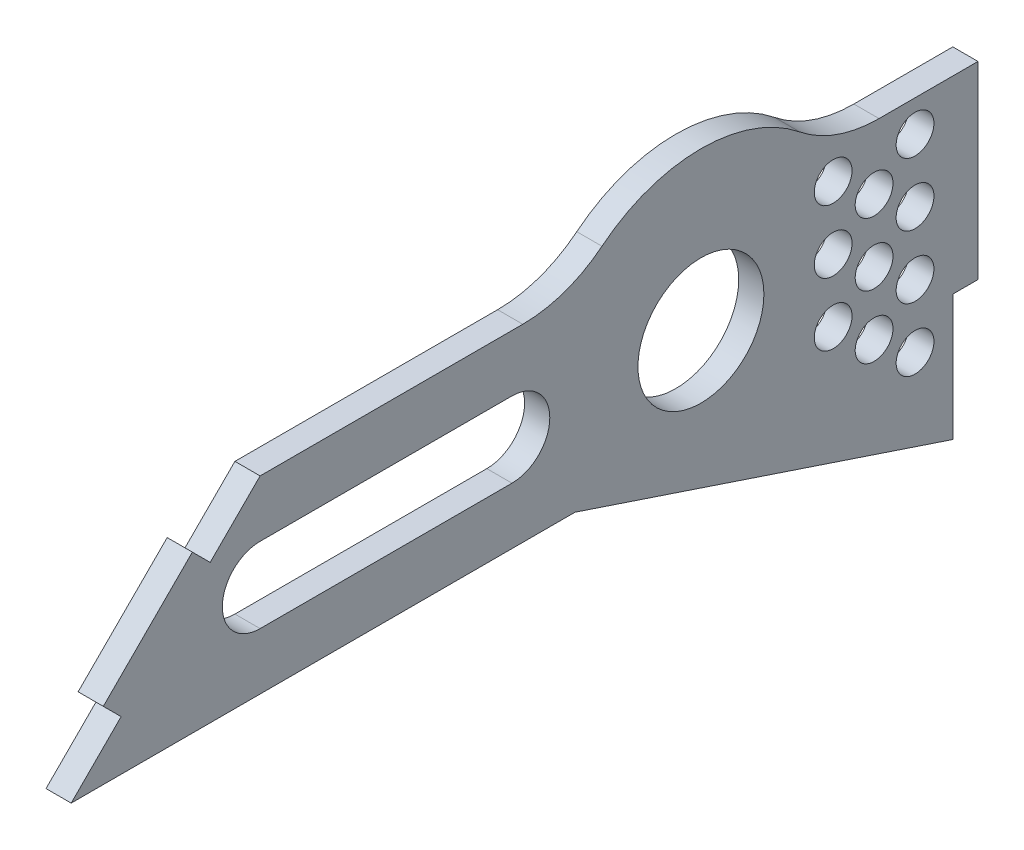
ISO-10303-21;
HEADER;
FILE_DESCRIPTION(('STEP AP214'),'2;1');
FILE_NAME('part.step','',(''),(''),'','','');
FILE_SCHEMA(('AUTOMOTIVE_DESIGN { 1 0 10303 214 1 1 1 1 }'));
ENDSEC;
DATA;
#1=APPLICATION_CONTEXT('core data for automotive mechanical design processes');
#2=APPLICATION_PROTOCOL_DEFINITION('international standard','automotive_design',2000,#1);
#3=PRODUCT_CONTEXT('',#1,'mechanical');
#4=PRODUCT('Part','Part','',(#3));
#5=PRODUCT_RELATED_PRODUCT_CATEGORY('part','',(#4));
#6=PRODUCT_DEFINITION_FORMATION('','',#4);
#7=PRODUCT_DEFINITION_CONTEXT('part definition',#1,'design');
#8=PRODUCT_DEFINITION('design','',#6,#7);
#9=PRODUCT_DEFINITION_SHAPE('','',#8);
#10=(LENGTH_UNIT() NAMED_UNIT(*) SI_UNIT(.MILLI.,.METRE.));
#11=(NAMED_UNIT(*) PLANE_ANGLE_UNIT() SI_UNIT($,.RADIAN.));
#12=(NAMED_UNIT(*) SI_UNIT($,.STERADIAN.) SOLID_ANGLE_UNIT());
#13=UNCERTAINTY_MEASURE_WITH_UNIT(LENGTH_MEASURE(1.E-05),#10,'distance_accuracy_value','');
#14=(GEOMETRIC_REPRESENTATION_CONTEXT(3) GLOBAL_UNCERTAINTY_ASSIGNED_CONTEXT((#13)) GLOBAL_UNIT_ASSIGNED_CONTEXT((#10,
#11,#12)) REPRESENTATION_CONTEXT('',''));
#15=CARTESIAN_POINT('',(0.,0.,0.));
#16=DIRECTION('',(0.,0.,1.));
#17=DIRECTION('',(1.,0.,0.));
#18=AXIS2_PLACEMENT_3D('',#15,#16,#17);
#19=CARTESIAN_POINT('',(4.,24.7157287525381,-78.2842712474619));
#20=DIRECTION('',(1.,0.,0.));
#21=DIRECTION('',(0.,0.,-1.));
#22=AXIS2_PLACEMENT_3D('',#19,#20,#21);
#23=PLANE('',#22);
#24=DIRECTION('',(0.,-1.,0.));
#25=VECTOR('',#24,1.);
#26=CARTESIAN_POINT('',(4.,-21.,-94.));
#27=LINE('',#26,#25);
#28=CARTESIAN_POINT('',(4.,9.00000000000001,-94.));
#29=VERTEX_POINT('',#28);
#30=CARTESIAN_POINT('',(4.,-21.,-94.));
#31=VERTEX_POINT('',#30);
#32=EDGE_CURVE('E181',#29,#31,#27,.T.);
#33=ORIENTED_EDGE('',*,*,#32,.F.);
#34=DIRECTION('',(0.,0.,-1.));
#35=VECTOR('',#34,1.);
#36=CARTESIAN_POINT('',(4.,9.00000000000001,-94.));
#37=LINE('',#36,#35);
#38=CARTESIAN_POINT('',(4.,9.00000000000001,-78.2842712474619));
#39=VERTEX_POINT('',#38);
#40=EDGE_CURVE('E169',#39,#29,#37,.T.);
#41=ORIENTED_EDGE('',*,*,#40,.F.);
#42=CARTESIAN_POINT('',(4.,29.,-78.2842712474619));
#43=DIRECTION('',(-1.,0.,0.));
#44=DIRECTION('',(0.,0.,-1.));
#45=AXIS2_PLACEMENT_3D('',#42,#43,#44);
#46=CIRCLE('',#45,20.);
#47=CARTESIAN_POINT('',(4.,13.4444444444445,-65.7134840263677));
#48=VERTEX_POINT('',#47);
#49=EDGE_CURVE('E178',#39,#48,#46,.T.);
#50=ORIENTED_EDGE('',*,*,#49,.T.);
#51=CARTESIAN_POINT('',(4.,-5.99999999999999,-50.));
#52=DIRECTION('',(1.,0.,0.));
#53=DIRECTION('',(0.,0.,-1.));
#54=AXIS2_PLACEMENT_3D('',#51,#52,#53);
#55=CIRCLE('',#54,25.);
#56=CARTESIAN_POINT('',(4.,13.4444444444444,-34.2865159736323));
#57=VERTEX_POINT('',#56);
#58=EDGE_CURVE('E185',#48,#57,#55,.T.);
#59=ORIENTED_EDGE('',*,*,#58,.T.);
#60=CARTESIAN_POINT('',(4.,29.,-21.7157287525381));
#61=DIRECTION('',(-1.,0.,0.));
#62=DIRECTION('',(0.,0.,-1.));
#63=AXIS2_PLACEMENT_3D('',#60,#61,#62);
#64=CIRCLE('',#63,20.);
#65=CARTESIAN_POINT('',(4.,9.00000000000001,-21.7157287525381));
#66=VERTEX_POINT('',#65);
#67=EDGE_CURVE('E188',#57,#66,#64,.T.);
#68=ORIENTED_EDGE('',*,*,#67,.T.);
#69=DIRECTION('',(0.,0.,1.));
#70=VECTOR('',#69,1.);
#71=CARTESIAN_POINT('',(4.,9.00000000000001,-21.7157287525381));
#72=LINE('',#71,#70);
#73=CARTESIAN_POINT('',(4.,9.00000000000001,20.0000000000001));
#74=VERTEX_POINT('',#73);
#75=EDGE_CURVE('E197',#66,#74,#72,.T.);
#76=ORIENTED_EDGE('',*,*,#75,.T.);
#77=DIRECTION('',(0.,-0.707106781186549,0.707106781186546));
#78=VECTOR('',#77,1.);
#79=CARTESIAN_POINT('',(4.,9.00000000000001,20.0000000000001));
#80=LINE('',#79,#78);
#81=CARTESIAN_POINT('',(4.,1.07106781186548,27.9289321881346));
#82=VERTEX_POINT('',#81);
#83=EDGE_CURVE('E199',#74,#82,#80,.T.);
#84=ORIENTED_EDGE('',*,*,#83,.T.);
#85=DIRECTION('',(0.,0.707106781186547,0.707106781186548));
#86=VECTOR('',#85,1.);
#87=CARTESIAN_POINT('',(4.,1.07106781186548,27.9289321881346));
#88=LINE('',#87,#86);
#89=CARTESIAN_POINT('',(4.,3.89949493661167,30.7573593128808));
#90=VERTEX_POINT('',#89);
#91=EDGE_CURVE('E201',#82,#90,#88,.T.);
#92=ORIENTED_EDGE('',*,*,#91,.T.);
#93=DIRECTION('',(0.,-0.707106781186549,0.707106781186546));
#94=VECTOR('',#93,1.);
#95=CARTESIAN_POINT('',(4.,3.89949493661167,30.7573593128808));
#96=LINE('',#95,#94);
#97=CARTESIAN_POINT('',(4.,-10.2426406871193,44.8994949366117));
#98=VERTEX_POINT('',#97);
#99=EDGE_CURVE('E203',#90,#98,#96,.T.);
#100=ORIENTED_EDGE('',*,*,#99,.T.);
#101=DIRECTION('',(0.,-0.70710678118654,-0.707106781186555));
#102=VECTOR('',#101,1.);
#103=CARTESIAN_POINT('',(4.,-10.2426406871193,44.8994949366117));
#104=LINE('',#103,#102);
#105=CARTESIAN_POINT('',(4.,-13.0710678118655,42.0710678118655));
#106=VERTEX_POINT('',#105);
#107=EDGE_CURVE('E205',#98,#106,#104,.T.);
#108=ORIENTED_EDGE('',*,*,#107,.T.);
#109=DIRECTION('',(0.,-0.707106781186549,0.707106781186546));
#110=VECTOR('',#109,1.);
#111=CARTESIAN_POINT('',(4.,-13.0710678118655,42.0710678118655));
#112=LINE('',#111,#110);
#113=CARTESIAN_POINT('',(4.,-21.,50.));
#114=VERTEX_POINT('',#113);
#115=EDGE_CURVE('E207',#106,#114,#112,.T.);
#116=ORIENTED_EDGE('',*,*,#115,.T.);
#117=DIRECTION('',(0.,0.,-1.));
#118=VECTOR('',#117,1.);
#119=CARTESIAN_POINT('',(4.,-21.,50.));
#120=LINE('',#119,#118);
#121=CARTESIAN_POINT('',(4.,-21.,-30.));
#122=VERTEX_POINT('',#121);
#123=EDGE_CURVE('E209',#114,#122,#120,.T.);
#124=ORIENTED_EDGE('',*,*,#123,.T.);
#125=DIRECTION('',(0.,-0.316227766016838,-0.948683298050514));
#126=VECTOR('',#125,1.);
#127=CARTESIAN_POINT('',(4.,-21.,-30.));
#128=LINE('',#127,#126);
#129=CARTESIAN_POINT('',(4.,-41.,-90.));
#130=VERTEX_POINT('',#129);
#131=EDGE_CURVE('E211',#122,#130,#128,.T.);
#132=ORIENTED_EDGE('',*,*,#131,.T.);
#133=DIRECTION('',(0.,1.,0.));
#134=VECTOR('',#133,1.);
#135=CARTESIAN_POINT('',(4.,-41.,-90.));
#136=LINE('',#135,#134);
#137=CARTESIAN_POINT('',(4.,-21.,-90.));
#138=VERTEX_POINT('',#137);
#139=EDGE_CURVE('E213',#130,#138,#136,.T.);
#140=ORIENTED_EDGE('',*,*,#139,.T.);
#141=DIRECTION('',(0.,0.,-1.));
#142=VECTOR('',#141,1.);
#143=CARTESIAN_POINT('',(4.,-21.,-90.));
#144=LINE('',#143,#142);
#145=EDGE_CURVE('E215',#138,#31,#144,.T.);
#146=ORIENTED_EDGE('',*,*,#145,.T.);
#147=EDGE_LOOP('',(#33,#41,#50,#59,#68,#76,#84,#92,#100,#108,#116,#124,#132,#140,#146));
#148=FACE_BOUND('',#147,.T.);
#149=CARTESIAN_POINT('',(4.,-26.,-84.0000000000003));
#150=DIRECTION('',(1.,0.,0.));
#151=DIRECTION('',(0.,0.,-1.));
#152=AXIS2_PLACEMENT_3D('',#149,#150,#151);
#153=CIRCLE('',#152,3.00000000000001);
#154=CARTESIAN_POINT('',(4.,-26.,-87.0000000000003));
#155=VERTEX_POINT('',#154);
#156=EDGE_CURVE('E643',#155,#155,#153,.T.);
#157=ORIENTED_EDGE('',*,*,#156,.F.);
#158=EDGE_LOOP('',(#157));
#159=FACE_BOUND('',#158,.T.);
#160=CARTESIAN_POINT('',(4.,-6.00000000000005,-70.9999999999999));
#161=DIRECTION('',(1.,0.,0.));
#162=DIRECTION('',(0.,0.,-1.));
#163=AXIS2_PLACEMENT_3D('',#160,#161,#162);
#164=CIRCLE('',#163,2.99999999999999);
#165=CARTESIAN_POINT('',(4.,-6.00000000000005,-73.9999999999999));
#166=VERTEX_POINT('',#165);
#167=EDGE_CURVE('E655',#166,#166,#164,.T.);
#168=ORIENTED_EDGE('',*,*,#167,.F.);
#169=EDGE_LOOP('',(#168));
#170=FACE_BOUND('',#169,.T.);
#171=CARTESIAN_POINT('',(4.,-16.,-84.0000000000002));
#172=DIRECTION('',(1.,0.,0.));
#173=DIRECTION('',(0.,0.,-1.));
#174=AXIS2_PLACEMENT_3D('',#171,#172,#173);
#175=CIRCLE('',#174,3.00000000000001);
#176=CARTESIAN_POINT('',(4.,-16.,-87.0000000000002));
#177=VERTEX_POINT('',#176);
#178=EDGE_CURVE('E667',#177,#177,#175,.T.);
#179=ORIENTED_EDGE('',*,*,#178,.F.);
#180=EDGE_LOOP('',(#179));
#181=FACE_BOUND('',#180,.T.);
#182=CARTESIAN_POINT('',(4.,-1.00000000000004,-77.5));
#183=DIRECTION('',(1.,0.,0.));
#184=DIRECTION('',(0.,0.,-1.));
#185=AXIS2_PLACEMENT_3D('',#182,#183,#184);
#186=CIRCLE('',#185,3.00000000000001);
#187=CARTESIAN_POINT('',(4.,-1.00000000000004,-80.5));
#188=VERTEX_POINT('',#187);
#189=EDGE_CURVE('E679',#188,#188,#186,.T.);
#190=ORIENTED_EDGE('',*,*,#189,.F.);
#191=EDGE_LOOP('',(#190));
#192=FACE_BOUND('',#191,.T.);
#193=CARTESIAN_POINT('',(4.,3.99999999999996,-84.));
#194=DIRECTION('',(1.,0.,0.));
#195=DIRECTION('',(0.,0.,-1.));
#196=AXIS2_PLACEMENT_3D('',#193,#194,#195);
#197=CIRCLE('',#196,2.99999999999999);
#198=CARTESIAN_POINT('',(4.,3.99999999999996,-87.));
#199=VERTEX_POINT('',#198);
#200=EDGE_CURVE('E691',#199,#199,#197,.T.);
#201=ORIENTED_EDGE('',*,*,#200,.F.);
#202=EDGE_LOOP('',(#201));
#203=FACE_BOUND('',#202,.T.);
#204=CARTESIAN_POINT('',(4.,-5.99999999999999,-50.));
#205=DIRECTION('',(1.,0.,0.));
#206=DIRECTION('',(0.,0.,-1.));
#207=AXIS2_PLACEMENT_3D('',#204,#205,#206);
#208=CIRCLE('',#207,10.);
#209=CARTESIAN_POINT('',(4.,-5.99999999999999,-60.));
#210=VERTEX_POINT('',#209);
#211=EDGE_CURVE('E697',#210,#210,#208,.T.);
#212=ORIENTED_EDGE('',*,*,#211,.F.);
#213=EDGE_LOOP('',(#212));
#214=FACE_BOUND('',#213,.T.);
#215=DIRECTION('',(0.,0.,1.));
#216=VECTOR('',#215,1.);
#217=CARTESIAN_POINT('',(4.,0.,-20.));
#218=LINE('',#217,#216);
#219=CARTESIAN_POINT('',(4.,0.,-20.));
#220=VERTEX_POINT('',#219);
#221=CARTESIAN_POINT('',(4.,0.,20.));
#222=VERTEX_POINT('',#221);
#223=EDGE_CURVE('E704',#220,#222,#218,.T.);
#224=ORIENTED_EDGE('',*,*,#223,.F.);
#225=CARTESIAN_POINT('',(4.,-5.99999999999999,-20.));
#226=DIRECTION('',(1.,0.,0.));
#227=DIRECTION('',(0.,0.,-1.));
#228=AXIS2_PLACEMENT_3D('',#225,#226,#227);
#229=CIRCLE('',#228,6.);
#230=CARTESIAN_POINT('',(4.,-12.,-20.));
#231=VERTEX_POINT('',#230);
#232=EDGE_CURVE('E702',#231,#220,#229,.T.);
#233=ORIENTED_EDGE('',*,*,#232,.F.);
#234=DIRECTION('',(0.,0.,-1.));
#235=VECTOR('',#234,1.);
#236=CARTESIAN_POINT('',(4.,-12.,20.));
#237=LINE('',#236,#235);
#238=CARTESIAN_POINT('',(4.,-12.,20.));
#239=VERTEX_POINT('',#238);
#240=EDGE_CURVE('E709',#239,#231,#237,.T.);
#241=ORIENTED_EDGE('',*,*,#240,.F.);
#242=CARTESIAN_POINT('',(4.,-6.00000000000001,20.));
#243=DIRECTION('',(1.,0.,0.));
#244=DIRECTION('',(0.,0.,-1.));
#245=AXIS2_PLACEMENT_3D('',#242,#243,#244);
#246=CIRCLE('',#245,6.);
#247=EDGE_CURVE('E707',#222,#239,#246,.T.);
#248=ORIENTED_EDGE('',*,*,#247,.F.);
#249=EDGE_LOOP('',(#224,#233,#241,#248));
#250=FACE_BOUND('',#249,.T.);
#251=CARTESIAN_POINT('',(4.,3.99999999999996,-71.));
#252=DIRECTION('',(1.,0.,0.));
#253=DIRECTION('',(0.,0.,-1.));
#254=AXIS2_PLACEMENT_3D('',#251,#252,#253);
#255=CIRCLE('',#254,3.00000000000001);
#256=CARTESIAN_POINT('',(4.,3.99999999999996,-74.));
#257=VERTEX_POINT('',#256);
#258=EDGE_CURVE('E685',#257,#257,#255,.T.);
#259=ORIENTED_EDGE('',*,*,#258,.F.);
#260=EDGE_LOOP('',(#259));
#261=FACE_BOUND('',#260,.T.);
#262=CARTESIAN_POINT('',(4.,-6.00000000000005,-84.0000000000001));
#263=DIRECTION('',(1.,0.,0.));
#264=DIRECTION('',(0.,0.,-1.));
#265=AXIS2_PLACEMENT_3D('',#262,#263,#264);
#266=CIRCLE('',#265,2.99999999999999);
#267=CARTESIAN_POINT('',(4.,-6.00000000000005,-87.0000000000001));
#268=VERTEX_POINT('',#267);
#269=EDGE_CURVE('E673',#268,#268,#266,.T.);
#270=ORIENTED_EDGE('',*,*,#269,.F.);
#271=EDGE_LOOP('',(#270));
#272=FACE_BOUND('',#271,.T.);
#273=CARTESIAN_POINT('',(4.,-11.,-77.5000000000001));
#274=DIRECTION('',(1.,0.,0.));
#275=DIRECTION('',(0.,0.,-1.));
#276=AXIS2_PLACEMENT_3D('',#273,#274,#275);
#277=CIRCLE('',#276,2.99999999999999);
#278=CARTESIAN_POINT('',(4.,-11.,-80.5000000000001));
#279=VERTEX_POINT('',#278);
#280=EDGE_CURVE('E661',#279,#279,#277,.T.);
#281=ORIENTED_EDGE('',*,*,#280,.F.);
#282=EDGE_LOOP('',(#281));
#283=FACE_BOUND('',#282,.T.);
#284=CARTESIAN_POINT('',(4.,-16.,-70.9999999999998));
#285=DIRECTION('',(1.,0.,0.));
#286=DIRECTION('',(0.,0.,-1.));
#287=AXIS2_PLACEMENT_3D('',#284,#285,#286);
#288=CIRCLE('',#287,3.00000000000001);
#289=CARTESIAN_POINT('',(4.,-16.,-73.9999999999998));
#290=VERTEX_POINT('',#289);
#291=EDGE_CURVE('E649',#290,#290,#288,.T.);
#292=ORIENTED_EDGE('',*,*,#291,.F.);
#293=EDGE_LOOP('',(#292));
#294=FACE_BOUND('',#293,.T.);
#295=CARTESIAN_POINT('',(4.,-21.,-77.5000000000002));
#296=DIRECTION('',(1.,0.,0.));
#297=DIRECTION('',(0.,0.,-1.));
#298=AXIS2_PLACEMENT_3D('',#295,#296,#297);
#299=CIRCLE('',#298,2.99999999999999);
#300=CARTESIAN_POINT('',(4.,-21.,-80.5000000000002));
#301=VERTEX_POINT('',#300);
#302=EDGE_CURVE('E633',#301,#301,#299,.T.);
#303=ORIENTED_EDGE('',*,*,#302,.F.);
#304=EDGE_LOOP('',(#303));
#305=FACE_BOUND('',#304,.T.);
#306=ADVANCED_FACE('F32',(#148,#159,#170,#181,#192,#203,#214,#250,#261,#272,#283,#294,#305),#23,.T.);
#307=CARTESIAN_POINT('',(0.,24.7157287525381,-78.2842712474619));
#308=DIRECTION('',(1.,0.,0.));
#309=DIRECTION('',(0.,0.,-1.));
#310=AXIS2_PLACEMENT_3D('',#307,#308,#309);
#311=PLANE('',#310);
#312=DIRECTION('',(0.,0.,-1.));
#313=VECTOR('',#312,1.);
#314=CARTESIAN_POINT('',(0.,9.00000000000001,-78.2842712474619));
#315=LINE('',#314,#313);
#316=CARTESIAN_POINT('',(0.,9.00000000000001,-78.2842712474619));
#317=VERTEX_POINT('',#316);
#318=CARTESIAN_POINT('',(0.,9.00000000000001,-94.));
#319=VERTEX_POINT('',#318);
#320=EDGE_CURVE('E172',#317,#319,#315,.T.);
#321=ORIENTED_EDGE('',*,*,#320,.T.);
#322=DIRECTION('',(0.,-1.,0.));
#323=VECTOR('',#322,1.);
#324=CARTESIAN_POINT('',(0.,24.7157287525381,-94.));
#325=LINE('',#324,#323);
#326=CARTESIAN_POINT('',(0.,-21.,-94.));
#327=VERTEX_POINT('',#326);
#328=EDGE_CURVE('E282',#319,#327,#325,.T.);
#329=ORIENTED_EDGE('',*,*,#328,.T.);
#330=DIRECTION('',(0.,0.,-1.));
#331=VECTOR('',#330,1.);
#332=CARTESIAN_POINT('',(0.,-21.,-90.));
#333=LINE('',#332,#331);
#334=CARTESIAN_POINT('',(0.,-21.,-90.));
#335=VERTEX_POINT('',#334);
#336=EDGE_CURVE('E186',#335,#327,#333,.T.);
#337=ORIENTED_EDGE('',*,*,#336,.F.);
#338=DIRECTION('',(0.,1.,0.));
#339=VECTOR('',#338,1.);
#340=CARTESIAN_POINT('',(0.,-41.,-90.));
#341=LINE('',#340,#339);
#342=CARTESIAN_POINT('',(0.,-41.,-90.));
#343=VERTEX_POINT('',#342);
#344=EDGE_CURVE('E191',#343,#335,#341,.T.);
#345=ORIENTED_EDGE('',*,*,#344,.F.);
#346=DIRECTION('',(0.,-0.316227766016838,-0.948683298050514));
#347=VECTOR('',#346,1.);
#348=CARTESIAN_POINT('',(0.,-21.,-30.));
#349=LINE('',#348,#347);
#350=CARTESIAN_POINT('',(0.,-21.,-30.));
#351=VERTEX_POINT('',#350);
#352=EDGE_CURVE('E239',#351,#343,#349,.T.);
#353=ORIENTED_EDGE('',*,*,#352,.F.);
#354=DIRECTION('',(0.,0.,-1.));
#355=VECTOR('',#354,1.);
#356=CARTESIAN_POINT('',(0.,-21.,-18.1966011250103));
#357=LINE('',#356,#355);
#358=CARTESIAN_POINT('',(0.,-21.,50.));
#359=VERTEX_POINT('',#358);
#360=EDGE_CURVE('E237',#359,#351,#357,.T.);
#361=ORIENTED_EDGE('',*,*,#360,.F.);
#362=DIRECTION('',(0.,-0.707106781186549,0.707106781186546));
#363=VECTOR('',#362,1.);
#364=CARTESIAN_POINT('',(0.,-13.0710678118655,42.0710678118655));
#365=LINE('',#364,#363);
#366=CARTESIAN_POINT('',(0.,-13.0710678118655,42.0710678118655));
#367=VERTEX_POINT('',#366);
#368=EDGE_CURVE('E234',#367,#359,#365,.T.);
#369=ORIENTED_EDGE('',*,*,#368,.F.);
#370=DIRECTION('',(0.,-0.70710678118654,-0.707106781186555));
#371=VECTOR('',#370,1.);
#372=CARTESIAN_POINT('',(0.,-10.2426406871193,44.8994949366117));
#373=LINE('',#372,#371);
#374=CARTESIAN_POINT('',(0.,-10.2426406871193,44.8994949366117));
#375=VERTEX_POINT('',#374);
#376=EDGE_CURVE('E232',#375,#367,#373,.T.);
#377=ORIENTED_EDGE('',*,*,#376,.F.);
#378=DIRECTION('',(0.,-0.707106781186549,0.707106781186546));
#379=VECTOR('',#378,1.);
#380=CARTESIAN_POINT('',(0.,3.89949493661167,30.7573593128808));
#381=LINE('',#380,#379);
#382=CARTESIAN_POINT('',(0.,3.89949493661167,30.7573593128808));
#383=VERTEX_POINT('',#382);
#384=EDGE_CURVE('E230',#383,#375,#381,.T.);
#385=ORIENTED_EDGE('',*,*,#384,.F.);
#386=DIRECTION('',(0.,0.707106781186547,0.707106781186548));
#387=VECTOR('',#386,1.);
#388=CARTESIAN_POINT('',(0.,1.07106781186548,27.9289321881346));
#389=LINE('',#388,#387);
#390=CARTESIAN_POINT('',(0.,1.07106781186548,27.9289321881346));
#391=VERTEX_POINT('',#390);
#392=EDGE_CURVE('E228',#391,#383,#389,.T.);
#393=ORIENTED_EDGE('',*,*,#392,.F.);
#394=DIRECTION('',(0.,-0.707106781186549,0.707106781186546));
#395=VECTOR('',#394,1.);
#396=CARTESIAN_POINT('',(0.,9.00000000000001,20.0000000000001));
#397=LINE('',#396,#395);
#398=CARTESIAN_POINT('',(0.,9.00000000000001,20.0000000000001));
#399=VERTEX_POINT('',#398);
#400=EDGE_CURVE('E226',#399,#391,#397,.T.);
#401=ORIENTED_EDGE('',*,*,#400,.F.);
#402=DIRECTION('',(0.,0.,1.));
#403=VECTOR('',#402,1.);
#404=CARTESIAN_POINT('',(0.,9.00000000000001,-21.7157287525381));
#405=LINE('',#404,#403);
#406=CARTESIAN_POINT('',(0.,9.00000000000001,-21.7157287525381));
#407=VERTEX_POINT('',#406);
#408=EDGE_CURVE('E224',#407,#399,#405,.T.);
#409=ORIENTED_EDGE('',*,*,#408,.F.);
#410=CARTESIAN_POINT('',(0.,29.,-21.7157287525381));
#411=DIRECTION('',(-1.,0.,0.));
#412=DIRECTION('',(0.,0.,-1.));
#413=AXIS2_PLACEMENT_3D('',#410,#411,#412);
#414=CIRCLE('',#413,20.);
#415=CARTESIAN_POINT('',(0.,13.4444444444444,-34.2865159736323));
#416=VERTEX_POINT('',#415);
#417=EDGE_CURVE('E222',#416,#407,#414,.T.);
#418=ORIENTED_EDGE('',*,*,#417,.F.);
#419=CARTESIAN_POINT('',(0.,-5.99999999999999,-50.));
#420=DIRECTION('',(1.,0.,0.));
#421=DIRECTION('',(0.,0.,-1.));
#422=AXIS2_PLACEMENT_3D('',#419,#420,#421);
#423=CIRCLE('',#422,25.);
#424=CARTESIAN_POINT('',(0.,13.4444444444445,-65.7134840263677));
#425=VERTEX_POINT('',#424);
#426=EDGE_CURVE('E220',#425,#416,#423,.T.);
#427=ORIENTED_EDGE('',*,*,#426,.F.);
#428=CARTESIAN_POINT('',(0.,29.,-78.2842712474619));
#429=DIRECTION('',(-1.,0.,0.));
#430=DIRECTION('',(0.,0.,-1.));
#431=AXIS2_PLACEMENT_3D('',#428,#429,#430);
#432=CIRCLE('',#431,20.);
#433=EDGE_CURVE('E218',#317,#425,#432,.T.);
#434=ORIENTED_EDGE('',*,*,#433,.F.);
#435=EDGE_LOOP('',(#321,#329,#337,#345,#353,#361,#369,#377,#385,#393,#401,#409,#418,#427,#434));
#436=FACE_BOUND('',#435,.T.);
#437=CARTESIAN_POINT('',(0.,-5.99999999999999,-20.));
#438=DIRECTION('',(1.,0.,0.));
#439=DIRECTION('',(0.,0.,-1.));
#440=AXIS2_PLACEMENT_3D('',#437,#438,#439);
#441=CIRCLE('',#440,6.);
#442=CARTESIAN_POINT('',(0.,-12.,-20.));
#443=VERTEX_POINT('',#442);
#444=CARTESIAN_POINT('',(0.,0.,-20.));
#445=VERTEX_POINT('',#444);
#446=EDGE_CURVE('E57',#443,#445,#441,.T.);
#447=ORIENTED_EDGE('',*,*,#446,.T.);
#448=DIRECTION('',(0.,0.,1.));
#449=VECTOR('',#448,1.);
#450=CARTESIAN_POINT('',(0.,0.,-20.));
#451=LINE('',#450,#449);
#452=CARTESIAN_POINT('',(0.,0.,20.));
#453=VERTEX_POINT('',#452);
#454=EDGE_CURVE('E713',#445,#453,#451,.T.);
#455=ORIENTED_EDGE('',*,*,#454,.T.);
#456=CARTESIAN_POINT('',(0.,-6.00000000000001,20.));
#457=DIRECTION('',(1.,0.,0.));
#458=DIRECTION('',(0.,0.,-1.));
#459=AXIS2_PLACEMENT_3D('',#456,#457,#458);
#460=CIRCLE('',#459,6.);
#461=CARTESIAN_POINT('',(0.,-12.,20.));
#462=VERTEX_POINT('',#461);
#463=EDGE_CURVE('E716',#453,#462,#460,.T.);
#464=ORIENTED_EDGE('',*,*,#463,.T.);
#465=DIRECTION('',(0.,0.,-1.));
#466=VECTOR('',#465,1.);
#467=CARTESIAN_POINT('',(0.,-12.,20.));
#468=LINE('',#467,#466);
#469=EDGE_CURVE('E705',#462,#443,#468,.T.);
#470=ORIENTED_EDGE('',*,*,#469,.T.);
#471=EDGE_LOOP('',(#447,#455,#464,#470));
#472=FACE_BOUND('',#471,.T.);
#473=CARTESIAN_POINT('',(0.,-5.99999999999999,-50.));
#474=DIRECTION('',(1.,0.,0.));
#475=DIRECTION('',(0.,0.,-1.));
#476=AXIS2_PLACEMENT_3D('',#473,#474,#475);
#477=CIRCLE('',#476,10.);
#478=CARTESIAN_POINT('',(0.,-5.99999999999999,-60.));
#479=VERTEX_POINT('',#478);
#480=EDGE_CURVE('E694',#479,#479,#477,.T.);
#481=ORIENTED_EDGE('',*,*,#480,.T.);
#482=EDGE_LOOP('',(#481));
#483=FACE_BOUND('',#482,.T.);
#484=CARTESIAN_POINT('',(0.,3.99999999999996,-84.));
#485=DIRECTION('',(1.,0.,0.));
#486=DIRECTION('',(0.,0.,-1.));
#487=AXIS2_PLACEMENT_3D('',#484,#485,#486);
#488=CIRCLE('',#487,2.99999999999999);
#489=CARTESIAN_POINT('',(0.,3.99999999999996,-87.));
#490=VERTEX_POINT('',#489);
#491=EDGE_CURVE('E688',#490,#490,#488,.T.);
#492=ORIENTED_EDGE('',*,*,#491,.T.);
#493=EDGE_LOOP('',(#492));
#494=FACE_BOUND('',#493,.T.);
#495=CARTESIAN_POINT('',(0.,3.99999999999996,-71.));
#496=DIRECTION('',(1.,0.,0.));
#497=DIRECTION('',(0.,0.,-1.));
#498=AXIS2_PLACEMENT_3D('',#495,#496,#497);
#499=CIRCLE('',#498,3.00000000000001);
#500=CARTESIAN_POINT('',(0.,3.99999999999996,-74.));
#501=VERTEX_POINT('',#500);
#502=EDGE_CURVE('E682',#501,#501,#499,.T.);
#503=ORIENTED_EDGE('',*,*,#502,.T.);
#504=EDGE_LOOP('',(#503));
#505=FACE_BOUND('',#504,.T.);
#506=CARTESIAN_POINT('',(0.,-1.00000000000004,-77.5));
#507=DIRECTION('',(1.,0.,0.));
#508=DIRECTION('',(0.,0.,-1.));
#509=AXIS2_PLACEMENT_3D('',#506,#507,#508);
#510=CIRCLE('',#509,3.00000000000001);
#511=CARTESIAN_POINT('',(0.,-1.00000000000004,-80.5));
#512=VERTEX_POINT('',#511);
#513=EDGE_CURVE('E676',#512,#512,#510,.T.);
#514=ORIENTED_EDGE('',*,*,#513,.T.);
#515=EDGE_LOOP('',(#514));
#516=FACE_BOUND('',#515,.T.);
#517=CARTESIAN_POINT('',(0.,-6.00000000000005,-84.0000000000001));
#518=DIRECTION('',(1.,0.,0.));
#519=DIRECTION('',(0.,0.,-1.));
#520=AXIS2_PLACEMENT_3D('',#517,#518,#519);
#521=CIRCLE('',#520,2.99999999999999);
#522=CARTESIAN_POINT('',(0.,-6.00000000000005,-87.0000000000001));
#523=VERTEX_POINT('',#522);
#524=EDGE_CURVE('E670',#523,#523,#521,.T.);
#525=ORIENTED_EDGE('',*,*,#524,.T.);
#526=EDGE_LOOP('',(#525));
#527=FACE_BOUND('',#526,.T.);
#528=CARTESIAN_POINT('',(0.,-16.,-84.0000000000002));
#529=DIRECTION('',(1.,0.,0.));
#530=DIRECTION('',(0.,0.,-1.));
#531=AXIS2_PLACEMENT_3D('',#528,#529,#530);
#532=CIRCLE('',#531,3.00000000000001);
#533=CARTESIAN_POINT('',(0.,-16.,-87.0000000000002));
#534=VERTEX_POINT('',#533);
#535=EDGE_CURVE('E664',#534,#534,#532,.T.);
#536=ORIENTED_EDGE('',*,*,#535,.T.);
#537=EDGE_LOOP('',(#536));
#538=FACE_BOUND('',#537,.T.);
#539=CARTESIAN_POINT('',(0.,-11.,-77.5000000000001));
#540=DIRECTION('',(1.,0.,0.));
#541=DIRECTION('',(0.,0.,-1.));
#542=AXIS2_PLACEMENT_3D('',#539,#540,#541);
#543=CIRCLE('',#542,2.99999999999999);
#544=CARTESIAN_POINT('',(0.,-11.,-80.5000000000001));
#545=VERTEX_POINT('',#544);
#546=EDGE_CURVE('E658',#545,#545,#543,.T.);
#547=ORIENTED_EDGE('',*,*,#546,.T.);
#548=EDGE_LOOP('',(#547));
#549=FACE_BOUND('',#548,.T.);
#550=CARTESIAN_POINT('',(0.,-6.00000000000005,-70.9999999999999));
#551=DIRECTION('',(1.,0.,0.));
#552=DIRECTION('',(0.,0.,-1.));
#553=AXIS2_PLACEMENT_3D('',#550,#551,#552);
#554=CIRCLE('',#553,2.99999999999999);
#555=CARTESIAN_POINT('',(0.,-6.00000000000005,-73.9999999999999));
#556=VERTEX_POINT('',#555);
#557=EDGE_CURVE('E652',#556,#556,#554,.T.);
#558=ORIENTED_EDGE('',*,*,#557,.T.);
#559=EDGE_LOOP('',(#558));
#560=FACE_BOUND('',#559,.T.);
#561=CARTESIAN_POINT('',(0.,-16.,-70.9999999999998));
#562=DIRECTION('',(1.,0.,0.));
#563=DIRECTION('',(0.,0.,-1.));
#564=AXIS2_PLACEMENT_3D('',#561,#562,#563);
#565=CIRCLE('',#564,3.00000000000001);
#566=CARTESIAN_POINT('',(0.,-16.,-73.9999999999998));
#567=VERTEX_POINT('',#566);
#568=EDGE_CURVE('E646',#567,#567,#565,.T.);
#569=ORIENTED_EDGE('',*,*,#568,.T.);
#570=EDGE_LOOP('',(#569));
#571=FACE_BOUND('',#570,.T.);
#572=CARTESIAN_POINT('',(0.,-26.,-84.0000000000003));
#573=DIRECTION('',(1.,0.,0.));
#574=DIRECTION('',(0.,0.,-1.));
#575=AXIS2_PLACEMENT_3D('',#572,#573,#574);
#576=CIRCLE('',#575,3.00000000000001);
#577=CARTESIAN_POINT('',(0.,-26.,-87.0000000000003));
#578=VERTEX_POINT('',#577);
#579=EDGE_CURVE('E639',#578,#578,#576,.T.);
#580=ORIENTED_EDGE('',*,*,#579,.T.);
#581=EDGE_LOOP('',(#580));
#582=FACE_BOUND('',#581,.T.);
#583=CARTESIAN_POINT('',(0.,-21.,-77.5000000000002));
#584=DIRECTION('',(1.,0.,0.));
#585=DIRECTION('',(0.,0.,-1.));
#586=AXIS2_PLACEMENT_3D('',#583,#584,#585);
#587=CIRCLE('',#586,2.99999999999999);
#588=CARTESIAN_POINT('',(0.,-21.,-80.5000000000002));
#589=VERTEX_POINT('',#588);
#590=EDGE_CURVE('E636',#589,#589,#587,.T.);
#591=ORIENTED_EDGE('',*,*,#590,.T.);
#592=EDGE_LOOP('',(#591));
#593=FACE_BOUND('',#592,.T.);
#594=ADVANCED_FACE('F287',(#436,#472,#483,#494,#505,#516,#527,#538,#549,#560,#571,#582,#593),
#311,.F.);
#595=CARTESIAN_POINT('',(4.,29.,-78.2842712474619));
#596=DIRECTION('',(-1.,0.,0.));
#597=DIRECTION('',(0.,0.,1.));
#598=AXIS2_PLACEMENT_3D('',#595,#596,#597);
#599=CYLINDRICAL_SURFACE('',#598,20.);
#600=ORIENTED_EDGE('',*,*,#433,.T.);
#601=DIRECTION('',(-1.,0.,0.));
#602=VECTOR('',#601,1.);
#603=CARTESIAN_POINT('',(4.,13.4444444444445,-65.7134840263677));
#604=LINE('',#603,#602);
#605=EDGE_CURVE('E41',#48,#425,#604,.T.);
#606=ORIENTED_EDGE('',*,*,#605,.F.);
#607=ORIENTED_EDGE('',*,*,#49,.F.);
#608=DIRECTION('',(-1.,0.,0.));
#609=VECTOR('',#608,1.);
#610=CARTESIAN_POINT('',(4.,9.00000000000001,-78.2842712474619));
#611=LINE('',#610,#609);
#612=EDGE_CURVE('E11',#39,#317,#611,.T.);
#613=ORIENTED_EDGE('',*,*,#612,.T.);
#614=EDGE_LOOP('',(#600,#606,#607,#613));
#615=FACE_BOUND('',#614,.T.);
#616=ADVANCED_FACE('F34',(#615),#599,.F.);
#617=CARTESIAN_POINT('',(4.,-5.99999999999999,-50.));
#618=DIRECTION('',(-1.,0.,0.));
#619=DIRECTION('',(0.,0.,1.));
#620=AXIS2_PLACEMENT_3D('',#617,#618,#619);
#621=CYLINDRICAL_SURFACE('',#620,25.);
#622=ORIENTED_EDGE('',*,*,#426,.T.);
#623=DIRECTION('',(-1.,0.,0.));
#624=VECTOR('',#623,1.);
#625=CARTESIAN_POINT('',(4.,13.4444444444444,-34.2865159736323));
#626=LINE('',#625,#624);
#627=EDGE_CURVE('E272',#57,#416,#626,.T.);
#628=ORIENTED_EDGE('',*,*,#627,.F.);
#629=ORIENTED_EDGE('',*,*,#58,.F.);
#630=ORIENTED_EDGE('',*,*,#605,.T.);
#631=EDGE_LOOP('',(#622,#628,#629,#630));
#632=FACE_BOUND('',#631,.T.);
#633=ADVANCED_FACE('F344',(#632),#621,.T.);
#634=CARTESIAN_POINT('',(4.,29.,-21.7157287525381));
#635=DIRECTION('',(-1.,0.,0.));
#636=DIRECTION('',(0.,0.,1.));
#637=AXIS2_PLACEMENT_3D('',#634,#635,#636);
#638=CYLINDRICAL_SURFACE('',#637,20.);
#639=ORIENTED_EDGE('',*,*,#417,.T.);
#640=DIRECTION('',(-1.,0.,0.));
#641=VECTOR('',#640,1.);
#642=CARTESIAN_POINT('',(4.,9.00000000000001,-21.7157287525381));
#643=LINE('',#642,#641);
#644=EDGE_CURVE('E269',#66,#407,#643,.T.);
#645=ORIENTED_EDGE('',*,*,#644,.F.);
#646=ORIENTED_EDGE('',*,*,#67,.F.);
#647=ORIENTED_EDGE('',*,*,#627,.T.);
#648=EDGE_LOOP('',(#639,#645,#646,#647));
#649=FACE_BOUND('',#648,.T.);
#650=ADVANCED_FACE('F340',(#649),#638,.F.);
#651=CARTESIAN_POINT('',(4.,9.00000000000001,-21.7157287525381));
#652=DIRECTION('',(0.,-1.,0.));
#653=DIRECTION('',(0.,0.,-1.));
#654=AXIS2_PLACEMENT_3D('',#651,#652,#653);
#655=PLANE('',#654);
#656=ORIENTED_EDGE('',*,*,#408,.T.);
#657=DIRECTION('',(-1.,0.,0.));
#658=VECTOR('',#657,1.);
#659=CARTESIAN_POINT('',(4.,9.00000000000001,20.0000000000001));
#660=LINE('',#659,#658);
#661=EDGE_CURVE('E266',#74,#399,#660,.T.);
#662=ORIENTED_EDGE('',*,*,#661,.F.);
#663=ORIENTED_EDGE('',*,*,#75,.F.);
#664=ORIENTED_EDGE('',*,*,#644,.T.);
#665=EDGE_LOOP('',(#656,#662,#663,#664));
#666=FACE_BOUND('',#665,.T.);
#667=ADVANCED_FACE('F336',(#666),#655,.F.);
#668=CARTESIAN_POINT('',(4.,9.00000000000001,20.0000000000001));
#669=DIRECTION('',(0.,-0.707106781186546,-0.707106781186549));
#670=DIRECTION('',(0.,0.707106781186549,-0.707106781186546));
#671=AXIS2_PLACEMENT_3D('',#668,#669,#670);
#672=PLANE('',#671);
#673=ORIENTED_EDGE('',*,*,#400,.T.);
#674=DIRECTION('',(-1.,0.,0.));
#675=VECTOR('',#674,1.);
#676=CARTESIAN_POINT('',(4.,1.07106781186548,27.9289321881346));
#677=LINE('',#676,#675);
#678=EDGE_CURVE('E263',#82,#391,#677,.T.);
#679=ORIENTED_EDGE('',*,*,#678,.F.);
#680=ORIENTED_EDGE('',*,*,#83,.F.);
#681=ORIENTED_EDGE('',*,*,#661,.T.);
#682=EDGE_LOOP('',(#673,#679,#680,#681));
#683=FACE_BOUND('',#682,.T.);
#684=ADVANCED_FACE('F331',(#683),#672,.F.);
#685=CARTESIAN_POINT('',(4.,1.07106781186548,27.9289321881346));
#686=DIRECTION('',(0.,-0.707106781186548,0.707106781186547));
#687=DIRECTION('',(0.,-0.707106781186547,-0.707106781186548));
#688=AXIS2_PLACEMENT_3D('',#685,#686,#687);
#689=PLANE('',#688);
#690=ORIENTED_EDGE('',*,*,#392,.T.);
#691=DIRECTION('',(-1.,0.,0.));
#692=VECTOR('',#691,1.);
#693=CARTESIAN_POINT('',(4.,3.89949493661167,30.7573593128808));
#694=LINE('',#693,#692);
#695=EDGE_CURVE('E260',#90,#383,#694,.T.);
#696=ORIENTED_EDGE('',*,*,#695,.F.);
#697=ORIENTED_EDGE('',*,*,#91,.F.);
#698=ORIENTED_EDGE('',*,*,#678,.T.);
#699=EDGE_LOOP('',(#690,#696,#697,#698));
#700=FACE_BOUND('',#699,.T.);
#701=ADVANCED_FACE('F325',(#700),#689,.F.);
#702=CARTESIAN_POINT('',(4.,3.89949493661167,30.7573593128808));
#703=DIRECTION('',(0.,-0.707106781186546,-0.707106781186549));
#704=DIRECTION('',(0.,0.707106781186549,-0.707106781186546));
#705=AXIS2_PLACEMENT_3D('',#702,#703,#704);
#706=PLANE('',#705);
#707=ORIENTED_EDGE('',*,*,#384,.T.);
#708=DIRECTION('',(-1.,0.,0.));
#709=VECTOR('',#708,1.);
#710=CARTESIAN_POINT('',(4.,-10.2426406871193,44.8994949366117));
#711=LINE('',#710,#709);
#712=EDGE_CURVE('E257',#98,#375,#711,.T.);
#713=ORIENTED_EDGE('',*,*,#712,.F.);
#714=ORIENTED_EDGE('',*,*,#99,.F.);
#715=ORIENTED_EDGE('',*,*,#695,.T.);
#716=EDGE_LOOP('',(#707,#713,#714,#715));
#717=FACE_BOUND('',#716,.T.);
#718=ADVANCED_FACE('F321',(#717),#706,.F.);
#719=CARTESIAN_POINT('',(4.,-10.2426406871193,44.8994949366117));
#720=DIRECTION('',(0.,0.707106781186555,-0.70710678118654));
#721=DIRECTION('',(0.,0.70710678118654,0.707106781186555));
#722=AXIS2_PLACEMENT_3D('',#719,#720,#721);
#723=PLANE('',#722);
#724=ORIENTED_EDGE('',*,*,#376,.T.);
#725=DIRECTION('',(-1.,0.,0.));
#726=VECTOR('',#725,1.);
#727=CARTESIAN_POINT('',(4.,-13.0710678118655,42.0710678118655));
#728=LINE('',#727,#726);
#729=EDGE_CURVE('E254',#106,#367,#728,.T.);
#730=ORIENTED_EDGE('',*,*,#729,.F.);
#731=ORIENTED_EDGE('',*,*,#107,.F.);
#732=ORIENTED_EDGE('',*,*,#712,.T.);
#733=EDGE_LOOP('',(#724,#730,#731,#732));
#734=FACE_BOUND('',#733,.T.);
#735=ADVANCED_FACE('F316',(#734),#723,.F.);
#736=CARTESIAN_POINT('',(4.,-13.0710678118655,42.0710678118655));
#737=DIRECTION('',(0.,-0.707106781186546,-0.707106781186549));
#738=DIRECTION('',(0.,0.707106781186549,-0.707106781186546));
#739=AXIS2_PLACEMENT_3D('',#736,#737,#738);
#740=PLANE('',#739);
#741=ORIENTED_EDGE('',*,*,#368,.T.);
#742=DIRECTION('',(-1.,0.,0.));
#743=VECTOR('',#742,1.);
#744=CARTESIAN_POINT('',(4.,-21.,50.));
#745=LINE('',#744,#743);
#746=EDGE_CURVE('E251',#114,#359,#745,.T.);
#747=ORIENTED_EDGE('',*,*,#746,.F.);
#748=ORIENTED_EDGE('',*,*,#115,.F.);
#749=ORIENTED_EDGE('',*,*,#729,.T.);
#750=EDGE_LOOP('',(#741,#747,#748,#749));
#751=FACE_BOUND('',#750,.T.);
#752=ADVANCED_FACE('F310',(#751),#740,.F.);
#753=CARTESIAN_POINT('',(4.,-21.,-18.1966011250103));
#754=DIRECTION('',(0.,1.,0.));
#755=DIRECTION('',(0.,0.,1.));
#756=AXIS2_PLACEMENT_3D('',#753,#754,#755);
#757=PLANE('',#756);
#758=ORIENTED_EDGE('',*,*,#360,.T.);
#759=DIRECTION('',(-1.,0.,0.));
#760=VECTOR('',#759,1.);
#761=CARTESIAN_POINT('',(4.,-21.,-30.));
#762=LINE('',#761,#760);
#763=EDGE_CURVE('E248',#122,#351,#762,.T.);
#764=ORIENTED_EDGE('',*,*,#763,.F.);
#765=ORIENTED_EDGE('',*,*,#123,.F.);
#766=ORIENTED_EDGE('',*,*,#746,.T.);
#767=EDGE_LOOP('',(#758,#764,#765,#766));
#768=FACE_BOUND('',#767,.T.);
#769=ADVANCED_FACE('F306',(#768),#757,.F.);
#770=CARTESIAN_POINT('',(4.,-21.,-30.));
#771=DIRECTION('',(0.,0.948683298050514,-0.316227766016838));
#772=DIRECTION('',(0.,0.316227766016838,0.948683298050514));
#773=AXIS2_PLACEMENT_3D('',#770,#771,#772);
#774=PLANE('',#773);
#775=ORIENTED_EDGE('',*,*,#352,.T.);
#776=DIRECTION('',(-1.,0.,0.));
#777=VECTOR('',#776,1.);
#778=CARTESIAN_POINT('',(4.,-41.,-90.));
#779=LINE('',#778,#777);
#780=EDGE_CURVE('E245',#130,#343,#779,.T.);
#781=ORIENTED_EDGE('',*,*,#780,.F.);
#782=ORIENTED_EDGE('',*,*,#131,.F.);
#783=ORIENTED_EDGE('',*,*,#763,.T.);
#784=EDGE_LOOP('',(#775,#781,#782,#783));
#785=FACE_BOUND('',#784,.T.);
#786=ADVANCED_FACE('F301',(#785),#774,.F.);
#787=CARTESIAN_POINT('',(4.,-41.,-90.));
#788=DIRECTION('',(0.,0.,1.));
#789=DIRECTION('',(1.,0.,0.));
#790=AXIS2_PLACEMENT_3D('',#787,#788,#789);
#791=PLANE('',#790);
#792=ORIENTED_EDGE('',*,*,#344,.T.);
#793=DIRECTION('',(-1.,0.,0.));
#794=VECTOR('',#793,1.);
#795=CARTESIAN_POINT('',(4.,-21.,-90.));
#796=LINE('',#795,#794);
#797=EDGE_CURVE('E242',#138,#335,#796,.T.);
#798=ORIENTED_EDGE('',*,*,#797,.F.);
#799=ORIENTED_EDGE('',*,*,#139,.F.);
#800=ORIENTED_EDGE('',*,*,#780,.T.);
#801=EDGE_LOOP('',(#792,#798,#799,#800));
#802=FACE_BOUND('',#801,.T.);
#803=ADVANCED_FACE('F296',(#802),#791,.F.);
#804=CARTESIAN_POINT('',(4.,-21.,-90.));
#805=DIRECTION('',(0.,1.,0.));
#806=DIRECTION('',(0.,0.,1.));
#807=AXIS2_PLACEMENT_3D('',#804,#805,#806);
#808=PLANE('',#807);
#809=ORIENTED_EDGE('',*,*,#336,.T.);
#810=DIRECTION('',(-1.,0.,0.));
#811=VECTOR('',#810,1.);
#812=CARTESIAN_POINT('',(4.,-21.,-94.));
#813=LINE('',#812,#811);
#814=EDGE_CURVE('E217',#31,#327,#813,.T.);
#815=ORIENTED_EDGE('',*,*,#814,.F.);
#816=ORIENTED_EDGE('',*,*,#145,.F.);
#817=ORIENTED_EDGE('',*,*,#797,.T.);
#818=EDGE_LOOP('',(#809,#815,#816,#817));
#819=FACE_BOUND('',#818,.T.);
#820=ADVANCED_FACE('F292',(#819),#808,.F.);
#821=CARTESIAN_POINT('',(4.,-5.99999999999999,-20.));
#822=DIRECTION('',(-1.,0.,0.));
#823=DIRECTION('',(0.,0.,1.));
#824=AXIS2_PLACEMENT_3D('',#821,#822,#823);
#825=CYLINDRICAL_SURFACE('',#824,6.);
#826=ORIENTED_EDGE('',*,*,#446,.F.);
#827=DIRECTION('',(-1.,0.,0.));
#828=VECTOR('',#827,1.);
#829=CARTESIAN_POINT('',(4.,-12.,-20.));
#830=LINE('',#829,#828);
#831=EDGE_CURVE('E711',#231,#443,#830,.T.);
#832=ORIENTED_EDGE('',*,*,#831,.F.);
#833=ORIENTED_EDGE('',*,*,#232,.T.);
#834=DIRECTION('',(-1.,0.,0.));
#835=VECTOR('',#834,1.);
#836=CARTESIAN_POINT('',(4.,0.,-20.));
#837=LINE('',#836,#835);
#838=EDGE_CURVE('E193',#220,#445,#837,.T.);
#839=ORIENTED_EDGE('',*,*,#838,.T.);
#840=EDGE_LOOP('',(#826,#832,#833,#839));
#841=FACE_BOUND('',#840,.T.);
#842=ADVANCED_FACE('F358',(#841),#825,.F.);
#843=CARTESIAN_POINT('',(4.,0.,-20.));
#844=DIRECTION('',(0.,-1.,0.));
#845=DIRECTION('',(0.,0.,-1.));
#846=AXIS2_PLACEMENT_3D('',#843,#844,#845);
#847=PLANE('',#846);
#848=ORIENTED_EDGE('',*,*,#454,.F.);
#849=ORIENTED_EDGE('',*,*,#838,.F.);
#850=ORIENTED_EDGE('',*,*,#223,.T.);
#851=DIRECTION('',(-1.,0.,0.));
#852=VECTOR('',#851,1.);
#853=CARTESIAN_POINT('',(4.,0.,20.));
#854=LINE('',#853,#852);
#855=EDGE_CURVE('E722',#222,#453,#854,.T.);
#856=ORIENTED_EDGE('',*,*,#855,.T.);
#857=EDGE_LOOP('',(#848,#849,#850,#856));
#858=FACE_BOUND('',#857,.T.);
#859=ADVANCED_FACE('F428',(#858),#847,.T.);
#860=CARTESIAN_POINT('',(4.,-6.00000000000001,20.));
#861=DIRECTION('',(-1.,0.,0.));
#862=DIRECTION('',(0.,0.,1.));
#863=AXIS2_PLACEMENT_3D('',#860,#861,#862);
#864=CYLINDRICAL_SURFACE('',#863,6.);
#865=ORIENTED_EDGE('',*,*,#463,.F.);
#866=ORIENTED_EDGE('',*,*,#855,.F.);
#867=ORIENTED_EDGE('',*,*,#247,.T.);
#868=DIRECTION('',(-1.,0.,0.));
#869=VECTOR('',#868,1.);
#870=CARTESIAN_POINT('',(4.,-12.,20.));
#871=LINE('',#870,#869);
#872=EDGE_CURVE('E49',#239,#462,#871,.T.);
#873=ORIENTED_EDGE('',*,*,#872,.T.);
#874=EDGE_LOOP('',(#865,#866,#867,#873));
#875=FACE_BOUND('',#874,.T.);
#876=ADVANCED_FACE('F434',(#875),#864,.F.);
#877=CARTESIAN_POINT('',(4.,-12.,20.));
#878=DIRECTION('',(0.,1.,0.));
#879=DIRECTION('',(0.,0.,1.));
#880=AXIS2_PLACEMENT_3D('',#877,#878,#879);
#881=PLANE('',#880);
#882=ORIENTED_EDGE('',*,*,#469,.F.);
#883=ORIENTED_EDGE('',*,*,#872,.F.);
#884=ORIENTED_EDGE('',*,*,#240,.T.);
#885=ORIENTED_EDGE('',*,*,#831,.T.);
#886=EDGE_LOOP('',(#882,#883,#884,#885));
#887=FACE_BOUND('',#886,.T.);
#888=ADVANCED_FACE('F441',(#887),#881,.T.);
#889=CARTESIAN_POINT('',(4.,-5.99999999999999,-50.));
#890=DIRECTION('',(-1.,0.,0.));
#891=DIRECTION('',(0.,0.,1.));
#892=AXIS2_PLACEMENT_3D('',#889,#890,#891);
#893=CYLINDRICAL_SURFACE('',#892,10.);
#894=ORIENTED_EDGE('',*,*,#211,.T.);
#895=EDGE_LOOP('',(#894));
#896=FACE_BOUND('',#895,.T.);
#897=ORIENTED_EDGE('',*,*,#480,.F.);
#898=EDGE_LOOP('',(#897));
#899=FACE_BOUND('',#898,.T.);
#900=ADVANCED_FACE('F449',(#896,#899),#893,.F.);
#901=CARTESIAN_POINT('',(4.,3.99999999999996,-84.));
#902=DIRECTION('',(-1.,0.,0.));
#903=DIRECTION('',(0.,0.,1.));
#904=AXIS2_PLACEMENT_3D('',#901,#902,#903);
#905=CYLINDRICAL_SURFACE('',#904,2.99999999999999);
#906=ORIENTED_EDGE('',*,*,#200,.T.);
#907=EDGE_LOOP('',(#906));
#908=FACE_BOUND('',#907,.T.);
#909=ORIENTED_EDGE('',*,*,#491,.F.);
#910=EDGE_LOOP('',(#909));
#911=FACE_BOUND('',#910,.T.);
#912=ADVANCED_FACE('F456',(#908,#911),#905,.F.);
#913=CARTESIAN_POINT('',(4.,3.99999999999996,-71.));
#914=DIRECTION('',(-1.,0.,0.));
#915=DIRECTION('',(0.,0.,1.));
#916=AXIS2_PLACEMENT_3D('',#913,#914,#915);
#917=CYLINDRICAL_SURFACE('',#916,3.00000000000001);
#918=ORIENTED_EDGE('',*,*,#258,.T.);
#919=EDGE_LOOP('',(#918));
#920=FACE_BOUND('',#919,.T.);
#921=ORIENTED_EDGE('',*,*,#502,.F.);
#922=EDGE_LOOP('',(#921));
#923=FACE_BOUND('',#922,.T.);
#924=ADVANCED_FACE('F464',(#920,#923),#917,.F.);
#925=CARTESIAN_POINT('',(4.,-1.00000000000004,-77.5));
#926=DIRECTION('',(-1.,0.,0.));
#927=DIRECTION('',(0.,0.,1.));
#928=AXIS2_PLACEMENT_3D('',#925,#926,#927);
#929=CYLINDRICAL_SURFACE('',#928,3.00000000000001);
#930=ORIENTED_EDGE('',*,*,#189,.T.);
#931=EDGE_LOOP('',(#930));
#932=FACE_BOUND('',#931,.T.);
#933=ORIENTED_EDGE('',*,*,#513,.F.);
#934=EDGE_LOOP('',(#933));
#935=FACE_BOUND('',#934,.T.);
#936=ADVANCED_FACE('F472',(#932,#935),#929,.F.);
#937=CARTESIAN_POINT('',(4.,-6.00000000000005,-84.0000000000001));
#938=DIRECTION('',(-1.,0.,0.));
#939=DIRECTION('',(0.,0.,1.));
#940=AXIS2_PLACEMENT_3D('',#937,#938,#939);
#941=CYLINDRICAL_SURFACE('',#940,2.99999999999999);
#942=ORIENTED_EDGE('',*,*,#269,.T.);
#943=EDGE_LOOP('',(#942));
#944=FACE_BOUND('',#943,.T.);
#945=ORIENTED_EDGE('',*,*,#524,.F.);
#946=EDGE_LOOP('',(#945));
#947=FACE_BOUND('',#946,.T.);
#948=ADVANCED_FACE('F480',(#944,#947),#941,.F.);
#949=CARTESIAN_POINT('',(4.,-16.,-84.0000000000002));
#950=DIRECTION('',(-1.,0.,0.));
#951=DIRECTION('',(0.,0.,1.));
#952=AXIS2_PLACEMENT_3D('',#949,#950,#951);
#953=CYLINDRICAL_SURFACE('',#952,3.00000000000001);
#954=ORIENTED_EDGE('',*,*,#178,.T.);
#955=EDGE_LOOP('',(#954));
#956=FACE_BOUND('',#955,.T.);
#957=ORIENTED_EDGE('',*,*,#535,.F.);
#958=EDGE_LOOP('',(#957));
#959=FACE_BOUND('',#958,.T.);
#960=ADVANCED_FACE('F488',(#956,#959),#953,.F.);
#961=CARTESIAN_POINT('',(4.,-11.,-77.5000000000001));
#962=DIRECTION('',(-1.,0.,0.));
#963=DIRECTION('',(0.,0.,1.));
#964=AXIS2_PLACEMENT_3D('',#961,#962,#963);
#965=CYLINDRICAL_SURFACE('',#964,2.99999999999999);
#966=ORIENTED_EDGE('',*,*,#280,.T.);
#967=EDGE_LOOP('',(#966));
#968=FACE_BOUND('',#967,.T.);
#969=ORIENTED_EDGE('',*,*,#546,.F.);
#970=EDGE_LOOP('',(#969));
#971=FACE_BOUND('',#970,.T.);
#972=ADVANCED_FACE('F496',(#968,#971),#965,.F.);
#973=CARTESIAN_POINT('',(4.,-6.00000000000005,-70.9999999999999));
#974=DIRECTION('',(-1.,0.,0.));
#975=DIRECTION('',(0.,0.,1.));
#976=AXIS2_PLACEMENT_3D('',#973,#974,#975);
#977=CYLINDRICAL_SURFACE('',#976,2.99999999999999);
#978=ORIENTED_EDGE('',*,*,#167,.T.);
#979=EDGE_LOOP('',(#978));
#980=FACE_BOUND('',#979,.T.);
#981=ORIENTED_EDGE('',*,*,#557,.F.);
#982=EDGE_LOOP('',(#981));
#983=FACE_BOUND('',#982,.T.);
#984=ADVANCED_FACE('F504',(#980,#983),#977,.F.);
#985=CARTESIAN_POINT('',(4.,-16.,-70.9999999999998));
#986=DIRECTION('',(-1.,0.,0.));
#987=DIRECTION('',(0.,0.,1.));
#988=AXIS2_PLACEMENT_3D('',#985,#986,#987);
#989=CYLINDRICAL_SURFACE('',#988,3.00000000000001);
#990=ORIENTED_EDGE('',*,*,#291,.T.);
#991=EDGE_LOOP('',(#990));
#992=FACE_BOUND('',#991,.T.);
#993=ORIENTED_EDGE('',*,*,#568,.F.);
#994=EDGE_LOOP('',(#993));
#995=FACE_BOUND('',#994,.T.);
#996=ADVANCED_FACE('F512',(#992,#995),#989,.F.);
#997=CARTESIAN_POINT('',(4.,-26.,-84.0000000000003));
#998=DIRECTION('',(-1.,0.,0.));
#999=DIRECTION('',(0.,0.,1.));
#1000=AXIS2_PLACEMENT_3D('',#997,#998,#999);
#1001=CYLINDRICAL_SURFACE('',#1000,3.00000000000001);
#1002=ORIENTED_EDGE('',*,*,#156,.T.);
#1003=EDGE_LOOP('',(#1002));
#1004=FACE_BOUND('',#1003,.T.);
#1005=ORIENTED_EDGE('',*,*,#579,.F.);
#1006=EDGE_LOOP('',(#1005));
#1007=FACE_BOUND('',#1006,.T.);
#1008=ADVANCED_FACE('F520',(#1004,#1007),#1001,.F.);
#1009=CARTESIAN_POINT('',(4.,-21.,-77.5000000000002));
#1010=DIRECTION('',(-1.,0.,0.));
#1011=DIRECTION('',(0.,0.,1.));
#1012=AXIS2_PLACEMENT_3D('',#1009,#1010,#1011);
#1013=CYLINDRICAL_SURFACE('',#1012,2.99999999999999);
#1014=ORIENTED_EDGE('',*,*,#302,.T.);
#1015=EDGE_LOOP('',(#1014));
#1016=FACE_BOUND('',#1015,.T.);
#1017=ORIENTED_EDGE('',*,*,#590,.F.);
#1018=EDGE_LOOP('',(#1017));
#1019=FACE_BOUND('',#1018,.T.);
#1020=ADVANCED_FACE('F528',(#1016,#1019),#1013,.F.);
#1021=CARTESIAN_POINT('',(-1.2E-05,9.00000000000001,-94.));
#1022=DIRECTION('',(0.,-1.,0.));
#1023=DIRECTION('',(0.,0.,-1.));
#1024=AXIS2_PLACEMENT_3D('',#1021,#1022,#1023);
#1025=PLANE('',#1024);
#1026=ORIENTED_EDGE('',*,*,#612,.F.);
#1027=ORIENTED_EDGE('',*,*,#40,.T.);
#1028=DIRECTION('',(1.,0.,0.));
#1029=VECTOR('',#1028,1.);
#1030=CARTESIAN_POINT('',(-1.2E-05,9.00000000000001,-94.));
#1031=LINE('',#1030,#1029);
#1032=EDGE_CURVE('E290',#319,#29,#1031,.T.);
#1033=ORIENTED_EDGE('',*,*,#1032,.F.);
#1034=ORIENTED_EDGE('',*,*,#320,.F.);
#1035=EDGE_LOOP('',(#1026,#1027,#1033,#1034));
#1036=FACE_BOUND('',#1035,.T.);
#1037=ADVANCED_FACE('F167',(#1036),#1025,.F.);
#1038=CARTESIAN_POINT('',(-1.2E-05,-21.,-94.));
#1039=DIRECTION('',(0.,0.,1.));
#1040=DIRECTION('',(1.,0.,0.));
#1041=AXIS2_PLACEMENT_3D('',#1038,#1039,#1040);
#1042=PLANE('',#1041);
#1043=ORIENTED_EDGE('',*,*,#1032,.T.);
#1044=ORIENTED_EDGE('',*,*,#32,.T.);
#1045=ORIENTED_EDGE('',*,*,#814,.T.);
#1046=ORIENTED_EDGE('',*,*,#328,.F.);
#1047=EDGE_LOOP('',(#1043,#1044,#1045,#1046));
#1048=FACE_BOUND('',#1047,.T.);
#1049=ADVANCED_FACE('F281',(#1048),#1042,.F.);
#1050=CLOSED_SHELL('',(#306,#594,#616,#633,#650,#667,#684,#701,#718,#735,#752,#769,#786,#803,
#820,#842,#859,#876,#888,#900,#912,#924,#936,#948,#960,#972,#984,#996,#1008,#1020,#1037,#1049));
#1051=MANIFOLD_SOLID_BREP('B2',#1050);
#1052=ADVANCED_BREP_SHAPE_REPRESENTATION('',(#18,#1051),#14);
#1053=SHAPE_DEFINITION_REPRESENTATION(#9,#1052);
ENDSEC;
END-ISO-10303-21;
